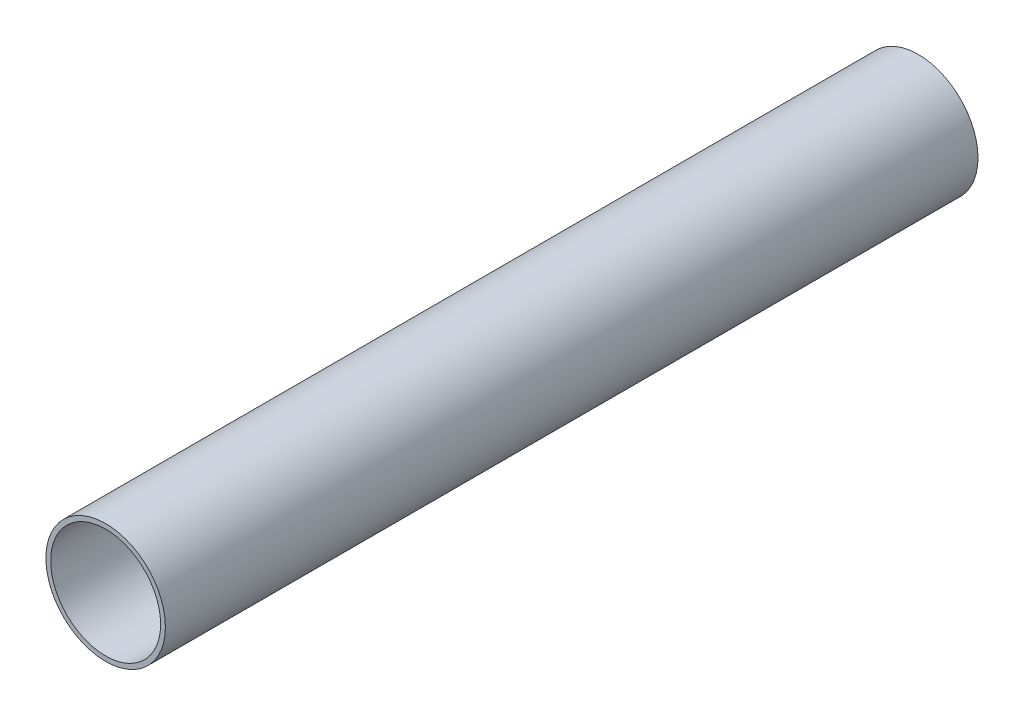
ISO-10303-21;
HEADER;
FILE_DESCRIPTION(('STEP AP214'),'2;1');
FILE_NAME('part.step','',(''),(''),'','','');
FILE_SCHEMA(('AUTOMOTIVE_DESIGN { 1 0 10303 214 1 1 1 1 }'));
ENDSEC;
DATA;
#1=APPLICATION_CONTEXT('core data for automotive mechanical design processes');
#2=APPLICATION_PROTOCOL_DEFINITION('international standard','automotive_design',2000,#1);
#3=PRODUCT_CONTEXT('',#1,'mechanical');
#4=PRODUCT('Part','Part','',(#3));
#5=PRODUCT_RELATED_PRODUCT_CATEGORY('part','',(#4));
#6=PRODUCT_DEFINITION_FORMATION('','',#4);
#7=PRODUCT_DEFINITION_CONTEXT('part definition',#1,'design');
#8=PRODUCT_DEFINITION('design','',#6,#7);
#9=PRODUCT_DEFINITION_SHAPE('','',#8);
#10=(LENGTH_UNIT() NAMED_UNIT(*) SI_UNIT(.MILLI.,.METRE.));
#11=(NAMED_UNIT(*) PLANE_ANGLE_UNIT() SI_UNIT($,.RADIAN.));
#12=(NAMED_UNIT(*) SI_UNIT($,.STERADIAN.) SOLID_ANGLE_UNIT());
#13=UNCERTAINTY_MEASURE_WITH_UNIT(LENGTH_MEASURE(1.E-05),#10,'distance_accuracy_value','');
#14=(GEOMETRIC_REPRESENTATION_CONTEXT(3) GLOBAL_UNCERTAINTY_ASSIGNED_CONTEXT((#13)) GLOBAL_UNIT_ASSIGNED_CONTEXT((#10,
#11,#12)) REPRESENTATION_CONTEXT('',''));
#15=CARTESIAN_POINT('',(0.,0.,0.));
#16=DIRECTION('',(0.,0.,1.));
#17=DIRECTION('',(1.,0.,0.));
#18=AXIS2_PLACEMENT_3D('',#15,#16,#17);
#19=CARTESIAN_POINT('',(0.,0.,170.));
#20=DIRECTION('',(0.,0.,1.));
#21=DIRECTION('',(1.,0.,0.));
#22=AXIS2_PLACEMENT_3D('',#19,#20,#21);
#23=PLANE('',#22);
#24=CARTESIAN_POINT('',(0.,0.,170.));
#25=DIRECTION('',(0.,0.,1.));
#26=DIRECTION('',(1.,0.,0.));
#27=AXIS2_PLACEMENT_3D('',#24,#25,#26);
#28=CIRCLE('',#27,12.5);
#29=CARTESIAN_POINT('',(12.5,0.,170.));
#30=VERTEX_POINT('',#29);
#31=EDGE_CURVE('E10',#30,#30,#28,.T.);
#32=ORIENTED_EDGE('',*,*,#31,.T.);
#33=EDGE_LOOP('',(#32));
#34=FACE_BOUND('',#33,.T.);
#35=CARTESIAN_POINT('',(0.,0.,170.));
#36=DIRECTION('',(0.,0.,1.));
#37=DIRECTION('',(1.,0.,0.));
#38=AXIS2_PLACEMENT_3D('',#35,#36,#37);
#39=CIRCLE('',#38,11.5);
#40=CARTESIAN_POINT('',(11.5,0.,170.));
#41=VERTEX_POINT('',#40);
#42=EDGE_CURVE('E46',#41,#41,#39,.T.);
#43=ORIENTED_EDGE('',*,*,#42,.F.);
#44=EDGE_LOOP('',(#43));
#45=FACE_BOUND('',#44,.T.);
#46=ADVANCED_FACE('F35',(#34,#45),#23,.T.);
#47=CARTESIAN_POINT('',(0.,0.,0.));
#48=DIRECTION('',(0.,0.,1.));
#49=DIRECTION('',(1.,0.,0.));
#50=AXIS2_PLACEMENT_3D('',#47,#48,#49);
#51=PLANE('',#50);
#52=CARTESIAN_POINT('',(0.,0.,0.));
#53=DIRECTION('',(0.,0.,1.));
#54=DIRECTION('',(1.,0.,0.));
#55=AXIS2_PLACEMENT_3D('',#52,#53,#54);
#56=CIRCLE('',#55,12.5);
#57=CARTESIAN_POINT('',(12.5,0.,0.));
#58=VERTEX_POINT('',#57);
#59=EDGE_CURVE('E39',#58,#58,#56,.T.);
#60=ORIENTED_EDGE('',*,*,#59,.F.);
#61=EDGE_LOOP('',(#60));
#62=FACE_BOUND('',#61,.T.);
#63=CARTESIAN_POINT('',(0.,0.,0.));
#64=DIRECTION('',(0.,0.,1.));
#65=DIRECTION('',(1.,0.,0.));
#66=AXIS2_PLACEMENT_3D('',#63,#64,#65);
#67=CIRCLE('',#66,11.5);
#68=CARTESIAN_POINT('',(11.5,0.,0.));
#69=VERTEX_POINT('',#68);
#70=EDGE_CURVE('E48',#69,#69,#67,.T.);
#71=ORIENTED_EDGE('',*,*,#70,.T.);
#72=EDGE_LOOP('',(#71));
#73=FACE_BOUND('',#72,.T.);
#74=ADVANCED_FACE('F58',(#62,#73),#51,.F.);
#75=CARTESIAN_POINT('',(0.,0.,170.));
#76=DIRECTION('',(0.,0.,-1.));
#77=DIRECTION('',(-1.,0.,0.));
#78=AXIS2_PLACEMENT_3D('',#75,#76,#77);
#79=CYLINDRICAL_SURFACE('',#78,12.5);
#80=ORIENTED_EDGE('',*,*,#31,.F.);
#81=EDGE_LOOP('',(#80));
#82=FACE_BOUND('',#81,.T.);
#83=ORIENTED_EDGE('',*,*,#59,.T.);
#84=EDGE_LOOP('',(#83));
#85=FACE_BOUND('',#84,.T.);
#86=ADVANCED_FACE('F37',(#82,#85),#79,.T.);
#87=CARTESIAN_POINT('',(0.,0.,170.));
#88=DIRECTION('',(0.,0.,-1.));
#89=DIRECTION('',(-1.,0.,0.));
#90=AXIS2_PLACEMENT_3D('',#87,#88,#89);
#91=CYLINDRICAL_SURFACE('',#90,11.5);
#92=ORIENTED_EDGE('',*,*,#42,.T.);
#93=EDGE_LOOP('',(#92));
#94=FACE_BOUND('',#93,.T.);
#95=ORIENTED_EDGE('',*,*,#70,.F.);
#96=EDGE_LOOP('',(#95));
#97=FACE_BOUND('',#96,.T.);
#98=ADVANCED_FACE('F54',(#94,#97),#91,.F.);
#99=CLOSED_SHELL('',(#46,#74,#86,#98));
#100=MANIFOLD_SOLID_BREP('B2',#99);
#101=ADVANCED_BREP_SHAPE_REPRESENTATION('',(#18,#100),#14);
#102=SHAPE_DEFINITION_REPRESENTATION(#9,#101);
ENDSEC;
END-ISO-10303-21;
